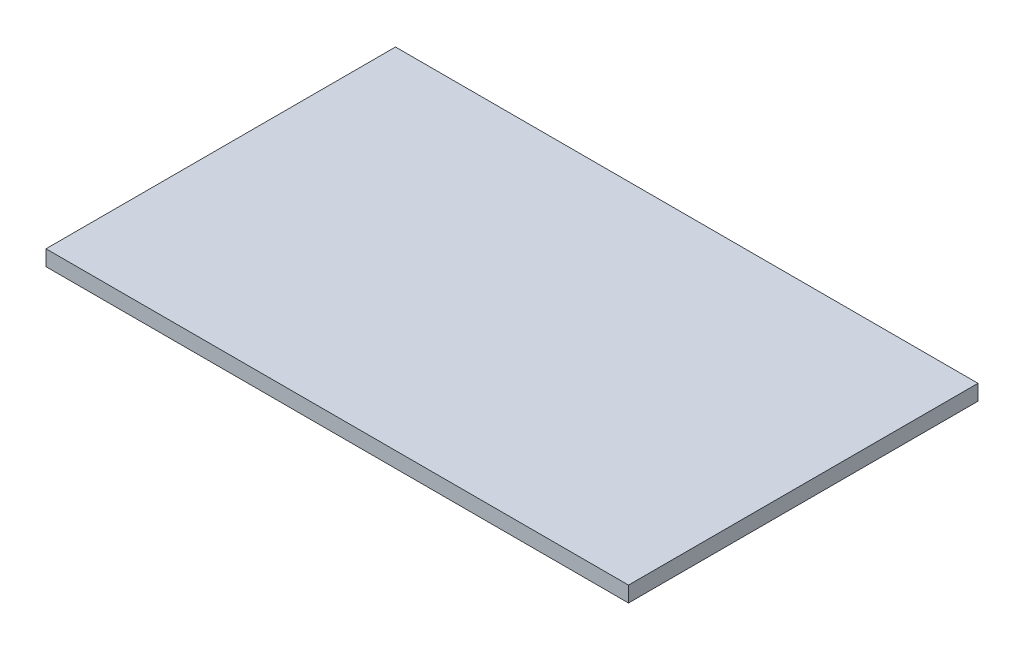
ISO-10303-21;
HEADER;
FILE_DESCRIPTION(('STEP AP214'),'2;1');
FILE_NAME('part.step','',(''),(''),'','','');
FILE_SCHEMA(('AUTOMOTIVE_DESIGN { 1 0 10303 214 1 1 1 1 }'));
ENDSEC;
DATA;
#1=APPLICATION_CONTEXT('core data for automotive mechanical design processes');
#2=APPLICATION_PROTOCOL_DEFINITION('international standard','automotive_design',2000,#1);
#3=PRODUCT_CONTEXT('',#1,'mechanical');
#4=PRODUCT('Part','Part','',(#3));
#5=PRODUCT_RELATED_PRODUCT_CATEGORY('part','',(#4));
#6=PRODUCT_DEFINITION_FORMATION('','',#4);
#7=PRODUCT_DEFINITION_CONTEXT('part definition',#1,'design');
#8=PRODUCT_DEFINITION('design','',#6,#7);
#9=PRODUCT_DEFINITION_SHAPE('','',#8);
#10=(LENGTH_UNIT() NAMED_UNIT(*) SI_UNIT(.MILLI.,.METRE.));
#11=(NAMED_UNIT(*) PLANE_ANGLE_UNIT() SI_UNIT($,.RADIAN.));
#12=(NAMED_UNIT(*) SI_UNIT($,.STERADIAN.) SOLID_ANGLE_UNIT());
#13=UNCERTAINTY_MEASURE_WITH_UNIT(LENGTH_MEASURE(1.E-05),#10,'distance_accuracy_value','');
#14=(GEOMETRIC_REPRESENTATION_CONTEXT(3) GLOBAL_UNCERTAINTY_ASSIGNED_CONTEXT((#13)) GLOBAL_UNIT_ASSIGNED_CONTEXT((#10,
#11,#12)) REPRESENTATION_CONTEXT('',''));
#15=CARTESIAN_POINT('',(0.,0.,0.));
#16=DIRECTION('',(0.,0.,1.));
#17=DIRECTION('',(1.,0.,0.));
#18=AXIS2_PLACEMENT_3D('',#15,#16,#17);
#19=CARTESIAN_POINT('',(-37.5,2.,22.5));
#20=DIRECTION('',(1.,0.,0.));
#21=DIRECTION('',(0.,0.,-1.));
#22=AXIS2_PLACEMENT_3D('',#19,#20,#21);
#23=PLANE('',#22);
#24=DIRECTION('',(0.,0.,1.));
#25=VECTOR('',#24,1.);
#26=CARTESIAN_POINT('',(-37.5,0.,22.5));
#27=LINE('',#26,#25);
#28=CARTESIAN_POINT('',(-37.5,0.,-22.5));
#29=VERTEX_POINT('',#28);
#30=CARTESIAN_POINT('',(-37.5,0.,22.5));
#31=VERTEX_POINT('',#30);
#32=EDGE_CURVE('E102',#29,#31,#27,.T.);
#33=ORIENTED_EDGE('',*,*,#32,.T.);
#34=DIRECTION('',(0.,-1.,0.));
#35=VECTOR('',#34,1.);
#36=CARTESIAN_POINT('',(-37.5,2.,22.5));
#37=LINE('',#36,#35);
#38=CARTESIAN_POINT('',(-37.5,2.,22.5));
#39=VERTEX_POINT('',#38);
#40=EDGE_CURVE('E11',#39,#31,#37,.T.);
#41=ORIENTED_EDGE('',*,*,#40,.F.);
#42=DIRECTION('',(0.,0.,1.));
#43=VECTOR('',#42,1.);
#44=CARTESIAN_POINT('',(-37.5,2.,22.5));
#45=LINE('',#44,#43);
#46=CARTESIAN_POINT('',(-37.5,2.,-22.5));
#47=VERTEX_POINT('',#46);
#48=EDGE_CURVE('E90',#47,#39,#45,.T.);
#49=ORIENTED_EDGE('',*,*,#48,.F.);
#50=DIRECTION('',(0.,-1.,0.));
#51=VECTOR('',#50,1.);
#52=CARTESIAN_POINT('',(-37.5,2.,-22.5));
#53=LINE('',#52,#51);
#54=EDGE_CURVE('E98',#47,#29,#53,.T.);
#55=ORIENTED_EDGE('',*,*,#54,.T.);
#56=EDGE_LOOP('',(#33,#41,#49,#55));
#57=FACE_BOUND('',#56,.T.);
#58=ADVANCED_FACE('F39',(#57),#23,.F.);
#59=CARTESIAN_POINT('',(37.5,2.,22.5));
#60=DIRECTION('',(0.,0.,-1.));
#61=DIRECTION('',(-1.,0.,0.));
#62=AXIS2_PLACEMENT_3D('',#59,#60,#61);
#63=PLANE('',#62);
#64=DIRECTION('',(1.,0.,0.));
#65=VECTOR('',#64,1.);
#66=CARTESIAN_POINT('',(37.5,0.,22.5));
#67=LINE('',#66,#65);
#68=CARTESIAN_POINT('',(37.5,0.,22.5));
#69=VERTEX_POINT('',#68);
#70=EDGE_CURVE('E94',#31,#69,#67,.T.);
#71=ORIENTED_EDGE('',*,*,#70,.T.);
#72=DIRECTION('',(0.,-1.,0.));
#73=VECTOR('',#72,1.);
#74=CARTESIAN_POINT('',(37.5,2.,22.5));
#75=LINE('',#74,#73);
#76=CARTESIAN_POINT('',(37.5,2.,22.5));
#77=VERTEX_POINT('',#76);
#78=EDGE_CURVE('E47',#77,#69,#75,.T.);
#79=ORIENTED_EDGE('',*,*,#78,.F.);
#80=DIRECTION('',(1.,0.,0.));
#81=VECTOR('',#80,1.);
#82=CARTESIAN_POINT('',(37.5,2.,22.5));
#83=LINE('',#82,#81);
#84=EDGE_CURVE('E85',#39,#77,#83,.T.);
#85=ORIENTED_EDGE('',*,*,#84,.F.);
#86=ORIENTED_EDGE('',*,*,#40,.T.);
#87=EDGE_LOOP('',(#71,#79,#85,#86));
#88=FACE_BOUND('',#87,.T.);
#89=ADVANCED_FACE('F93',(#88),#63,.F.);
#90=CARTESIAN_POINT('',(37.5,2.,22.5));
#91=DIRECTION('',(-1.,0.,0.));
#92=DIRECTION('',(0.,0.,1.));
#93=AXIS2_PLACEMENT_3D('',#90,#91,#92);
#94=PLANE('',#93);
#95=DIRECTION('',(0.,0.,-1.));
#96=VECTOR('',#95,1.);
#97=CARTESIAN_POINT('',(37.5,0.,22.5));
#98=LINE('',#97,#96);
#99=CARTESIAN_POINT('',(37.5,0.,-22.5));
#100=VERTEX_POINT('',#99);
#101=EDGE_CURVE('E72',#69,#100,#98,.T.);
#102=ORIENTED_EDGE('',*,*,#101,.T.);
#103=DIRECTION('',(0.,-1.,0.));
#104=VECTOR('',#103,1.);
#105=CARTESIAN_POINT('',(37.5,2.,-22.5));
#106=LINE('',#105,#104);
#107=CARTESIAN_POINT('',(37.5,2.,-22.5));
#108=VERTEX_POINT('',#107);
#109=EDGE_CURVE('E95',#108,#100,#106,.T.);
#110=ORIENTED_EDGE('',*,*,#109,.F.);
#111=DIRECTION('',(0.,0.,-1.));
#112=VECTOR('',#111,1.);
#113=CARTESIAN_POINT('',(37.5,2.,22.5));
#114=LINE('',#113,#112);
#115=EDGE_CURVE('E88',#77,#108,#114,.T.);
#116=ORIENTED_EDGE('',*,*,#115,.F.);
#117=ORIENTED_EDGE('',*,*,#78,.T.);
#118=EDGE_LOOP('',(#102,#110,#116,#117));
#119=FACE_BOUND('',#118,.T.);
#120=ADVANCED_FACE('F96',(#119),#94,.F.);
#121=CARTESIAN_POINT('',(37.5,2.,-22.5));
#122=DIRECTION('',(0.,0.,1.));
#123=DIRECTION('',(1.,0.,0.));
#124=AXIS2_PLACEMENT_3D('',#121,#122,#123);
#125=PLANE('',#124);
#126=DIRECTION('',(-1.,0.,0.));
#127=VECTOR('',#126,1.);
#128=CARTESIAN_POINT('',(37.5,0.,-22.5));
#129=LINE('',#128,#127);
#130=EDGE_CURVE('E78',#100,#29,#129,.T.);
#131=ORIENTED_EDGE('',*,*,#130,.T.);
#132=ORIENTED_EDGE('',*,*,#54,.F.);
#133=DIRECTION('',(-1.,0.,0.));
#134=VECTOR('',#133,1.);
#135=CARTESIAN_POINT('',(37.5,2.,-22.5));
#136=LINE('',#135,#134);
#137=EDGE_CURVE('E55',#108,#47,#136,.T.);
#138=ORIENTED_EDGE('',*,*,#137,.F.);
#139=ORIENTED_EDGE('',*,*,#109,.T.);
#140=EDGE_LOOP('',(#131,#132,#138,#139));
#141=FACE_BOUND('',#140,.T.);
#142=ADVANCED_FACE('F109',(#141),#125,.F.);
#143=CARTESIAN_POINT('',(0.,2.,0.));
#144=DIRECTION('',(0.,1.,0.));
#145=DIRECTION('',(0.,0.,1.));
#146=AXIS2_PLACEMENT_3D('',#143,#144,#145);
#147=PLANE('',#146);
#148=ORIENTED_EDGE('',*,*,#48,.T.);
#149=ORIENTED_EDGE('',*,*,#84,.T.);
#150=ORIENTED_EDGE('',*,*,#115,.T.);
#151=ORIENTED_EDGE('',*,*,#137,.T.);
#152=EDGE_LOOP('',(#148,#149,#150,#151));
#153=FACE_BOUND('',#152,.T.);
#154=ADVANCED_FACE('F86',(#153),#147,.T.);
#155=CARTESIAN_POINT('',(0.,0.,0.));
#156=DIRECTION('',(0.,1.,0.));
#157=DIRECTION('',(0.,0.,1.));
#158=AXIS2_PLACEMENT_3D('',#155,#156,#157);
#159=PLANE('',#158);
#160=ORIENTED_EDGE('',*,*,#32,.F.);
#161=ORIENTED_EDGE('',*,*,#130,.F.);
#162=ORIENTED_EDGE('',*,*,#101,.F.);
#163=ORIENTED_EDGE('',*,*,#70,.F.);
#164=EDGE_LOOP('',(#160,#161,#162,#163));
#165=FACE_BOUND('',#164,.T.);
#166=ADVANCED_FACE('F112',(#165),#159,.F.);
#167=CLOSED_SHELL('',(#58,#89,#120,#142,#154,#166));
#168=MANIFOLD_SOLID_BREP('B2',#167);
#169=ADVANCED_BREP_SHAPE_REPRESENTATION('',(#18,#168),#14);
#170=SHAPE_DEFINITION_REPRESENTATION(#9,#169);
ENDSEC;
END-ISO-10303-21;
